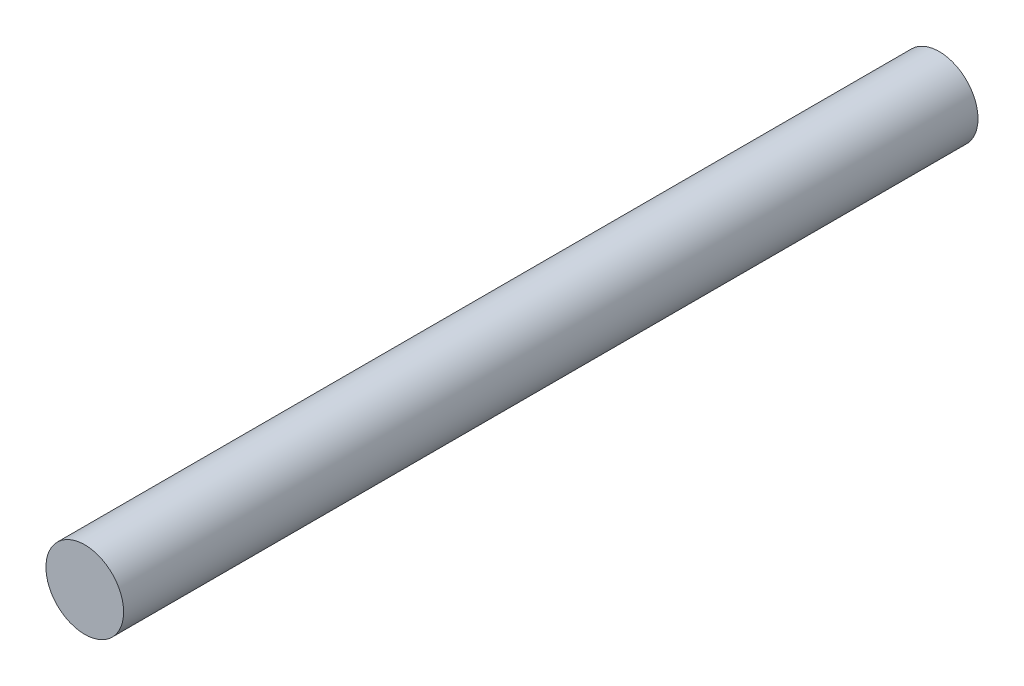
ISO-10303-21;
HEADER;
FILE_DESCRIPTION(('STEP AP214'),'2;1');
FILE_NAME('part.step','',(''),(''),'','','');
FILE_SCHEMA(('AUTOMOTIVE_DESIGN { 1 0 10303 214 1 1 1 1 }'));
ENDSEC;
DATA;
#1=APPLICATION_CONTEXT('core data for automotive mechanical design processes');
#2=APPLICATION_PROTOCOL_DEFINITION('international standard','automotive_design',2000,#1);
#3=PRODUCT_CONTEXT('',#1,'mechanical');
#4=PRODUCT('Part','Part','',(#3));
#5=PRODUCT_RELATED_PRODUCT_CATEGORY('part','',(#4));
#6=PRODUCT_DEFINITION_FORMATION('','',#4);
#7=PRODUCT_DEFINITION_CONTEXT('part definition',#1,'design');
#8=PRODUCT_DEFINITION('design','',#6,#7);
#9=PRODUCT_DEFINITION_SHAPE('','',#8);
#10=(LENGTH_UNIT() NAMED_UNIT(*) SI_UNIT(.MILLI.,.METRE.));
#11=(NAMED_UNIT(*) PLANE_ANGLE_UNIT() SI_UNIT($,.RADIAN.));
#12=(NAMED_UNIT(*) SI_UNIT($,.STERADIAN.) SOLID_ANGLE_UNIT());
#13=UNCERTAINTY_MEASURE_WITH_UNIT(LENGTH_MEASURE(1.E-05),#10,'distance_accuracy_value','');
#14=(GEOMETRIC_REPRESENTATION_CONTEXT(3) GLOBAL_UNCERTAINTY_ASSIGNED_CONTEXT((#13)) GLOBAL_UNIT_ASSIGNED_CONTEXT((#10,
#11,#12)) REPRESENTATION_CONTEXT('',''));
#15=CARTESIAN_POINT('',(0.,0.,0.));
#16=DIRECTION('',(0.,0.,1.));
#17=DIRECTION('',(1.,0.,0.));
#18=AXIS2_PLACEMENT_3D('',#15,#16,#17);
#19=CARTESIAN_POINT('',(0.,0.,55.));
#20=DIRECTION('',(0.,0.,-1.));
#21=DIRECTION('',(-1.,0.,0.));
#22=AXIS2_PLACEMENT_3D('',#19,#20,#21);
#23=CYLINDRICAL_SURFACE('',#22,2.5);
#24=CARTESIAN_POINT('',(0.,0.,55.));
#25=DIRECTION('',(0.,0.,1.));
#26=DIRECTION('',(1.,0.,0.));
#27=AXIS2_PLACEMENT_3D('',#24,#25,#26);
#28=CIRCLE('',#27,2.5);
#29=CARTESIAN_POINT('',(2.5,0.,55.));
#30=VERTEX_POINT('',#29);
#31=EDGE_CURVE('E10',#30,#30,#28,.T.);
#32=ORIENTED_EDGE('',*,*,#31,.F.);
#33=EDGE_LOOP('',(#32));
#34=FACE_BOUND('',#33,.T.);
#35=CARTESIAN_POINT('',(0.,0.,0.));
#36=DIRECTION('',(0.,0.,1.));
#37=DIRECTION('',(1.,0.,0.));
#38=AXIS2_PLACEMENT_3D('',#35,#36,#37);
#39=CIRCLE('',#38,2.5);
#40=CARTESIAN_POINT('',(2.5,0.,0.));
#41=VERTEX_POINT('',#40);
#42=EDGE_CURVE('E36',#41,#41,#39,.T.);
#43=ORIENTED_EDGE('',*,*,#42,.T.);
#44=EDGE_LOOP('',(#43));
#45=FACE_BOUND('',#44,.T.);
#46=ADVANCED_FACE('F33',(#34,#45),#23,.T.);
#47=CARTESIAN_POINT('',(0.,0.,55.));
#48=DIRECTION('',(0.,0.,1.));
#49=DIRECTION('',(1.,0.,0.));
#50=AXIS2_PLACEMENT_3D('',#47,#48,#49);
#51=PLANE('',#50);
#52=ORIENTED_EDGE('',*,*,#31,.T.);
#53=EDGE_LOOP('',(#52));
#54=FACE_BOUND('',#53,.T.);
#55=ADVANCED_FACE('F48',(#54),#51,.T.);
#56=CARTESIAN_POINT('',(0.,0.,0.));
#57=DIRECTION('',(0.,0.,1.));
#58=DIRECTION('',(1.,0.,0.));
#59=AXIS2_PLACEMENT_3D('',#56,#57,#58);
#60=PLANE('',#59);
#61=ORIENTED_EDGE('',*,*,#42,.F.);
#62=EDGE_LOOP('',(#61));
#63=FACE_BOUND('',#62,.T.);
#64=ADVANCED_FACE('F46',(#63),#60,.F.);
#65=CLOSED_SHELL('',(#46,#55,#64));
#66=MANIFOLD_SOLID_BREP('B2',#65);
#67=ADVANCED_BREP_SHAPE_REPRESENTATION('',(#18,#66),#14);
#68=SHAPE_DEFINITION_REPRESENTATION(#9,#67);
ENDSEC;
END-ISO-10303-21;
